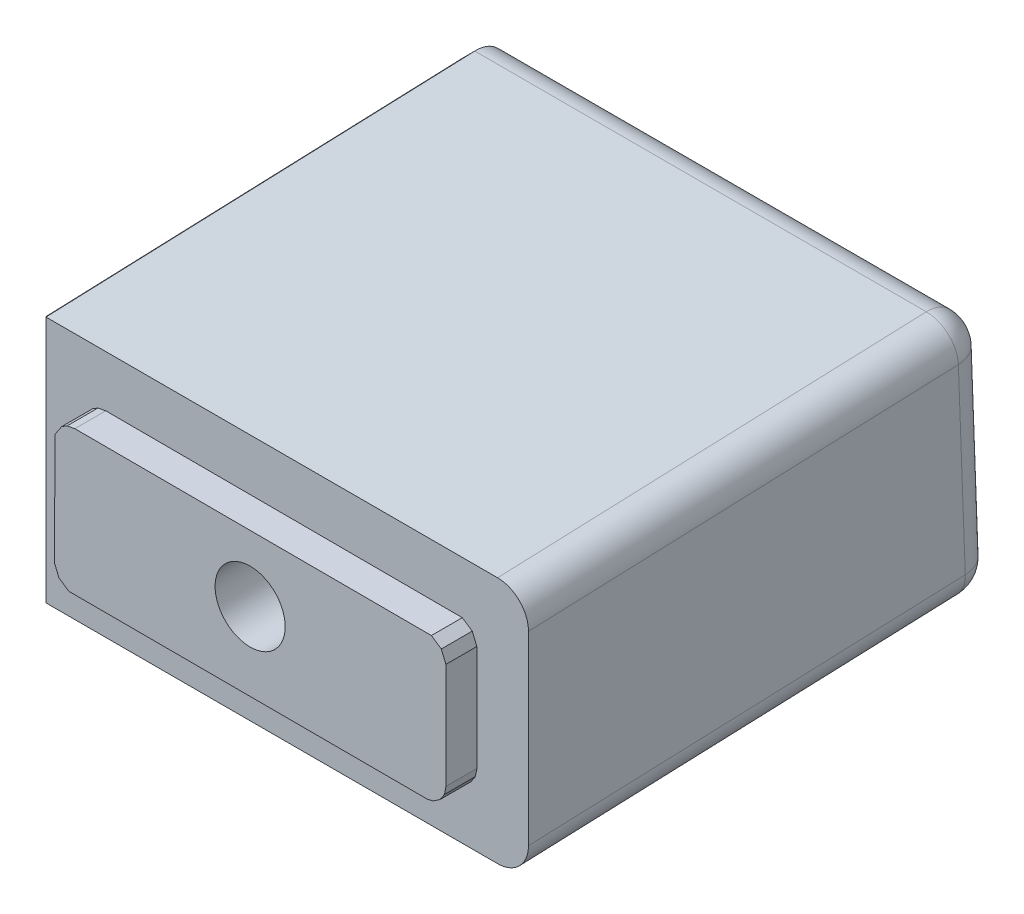
ISO-10303-21;
HEADER;
FILE_DESCRIPTION(('STEP AP214'),'2;1');
FILE_NAME('part.step','',(''),(''),'','','');
FILE_SCHEMA(('AUTOMOTIVE_DESIGN { 1 0 10303 214 1 1 1 1 }'));
ENDSEC;
DATA;
#1=APPLICATION_CONTEXT('core data for automotive mechanical design processes');
#2=APPLICATION_PROTOCOL_DEFINITION('international standard','automotive_design',2000,#1);
#3=PRODUCT_CONTEXT('',#1,'mechanical');
#4=PRODUCT('Part','Part','',(#3));
#5=PRODUCT_RELATED_PRODUCT_CATEGORY('part','',(#4));
#6=PRODUCT_DEFINITION_FORMATION('','',#4);
#7=PRODUCT_DEFINITION_CONTEXT('part definition',#1,'design');
#8=PRODUCT_DEFINITION('design','',#6,#7);
#9=PRODUCT_DEFINITION_SHAPE('','',#8);
#10=(LENGTH_UNIT() NAMED_UNIT(*) SI_UNIT(.MILLI.,.METRE.));
#11=(NAMED_UNIT(*) PLANE_ANGLE_UNIT() SI_UNIT($,.RADIAN.));
#12=(NAMED_UNIT(*) SI_UNIT($,.STERADIAN.) SOLID_ANGLE_UNIT());
#13=UNCERTAINTY_MEASURE_WITH_UNIT(LENGTH_MEASURE(1.E-05),#10,'distance_accuracy_value','');
#14=(GEOMETRIC_REPRESENTATION_CONTEXT(3) GLOBAL_UNCERTAINTY_ASSIGNED_CONTEXT((#13)) GLOBAL_UNIT_ASSIGNED_CONTEXT((#10,
#11,#12)) REPRESENTATION_CONTEXT('',''));
#15=CARTESIAN_POINT('',(0.,0.,0.));
#16=DIRECTION('',(0.,0.,1.));
#17=DIRECTION('',(1.,0.,0.));
#18=AXIS2_PLACEMENT_3D('',#15,#16,#17);
#19=CARTESIAN_POINT('',(2.85,93.6,-63.));
#20=DIRECTION('',(0.,0.,1.));
#21=DIRECTION('',(1.,0.,0.));
#22=AXIS2_PLACEMENT_3D('',#19,#20,#21);
#23=CYLINDRICAL_SURFACE('',#22,1.7);
#24=CARTESIAN_POINT('',(2.85,93.6,-27.6));
#25=DIRECTION('',(0.,0.,1.));
#26=DIRECTION('',(1.,0.,0.));
#27=AXIS2_PLACEMENT_3D('',#24,#25,#26);
#28=CIRCLE('',#27,1.7);
#29=CARTESIAN_POINT('',(4.55,93.6,-27.6));
#30=VERTEX_POINT('',#29);
#31=EDGE_CURVE('E25',#30,#30,#28,.T.);
#32=ORIENTED_EDGE('',*,*,#31,.F.);
#33=DIRECTION('',(0.,0.,1.));
#34=VECTOR('',#33,1.);
#35=CARTESIAN_POINT('',(4.55,93.6,-63.));
#36=LINE('',#35,#34);
#37=CARTESIAN_POINT('',(4.55,93.6,-6.5));
#38=VERTEX_POINT('',#37);
#39=EDGE_CURVE('E9',#30,#38,#36,.T.);
#40=ORIENTED_EDGE('',*,*,#39,.T.);
#41=CARTESIAN_POINT('',(2.85,93.6,-6.5));
#42=DIRECTION('',(0.,0.,1.));
#43=DIRECTION('',(1.,0.,0.));
#44=AXIS2_PLACEMENT_3D('',#41,#42,#43);
#45=CIRCLE('',#44,1.7);
#46=EDGE_CURVE('E382',#38,#38,#45,.T.);
#47=ORIENTED_EDGE('',*,*,#46,.T.);
#48=ORIENTED_EDGE('',*,*,#39,.F.);
#49=EDGE_LOOP('',(#32,#40,#47,#48));
#50=FACE_BOUND('',#49,.T.);
#51=ADVANCED_FACE('F14',(#50),#23,.F.);
#52=CARTESIAN_POINT('',(2.85,93.6,-27.6));
#53=DIRECTION('',(0.,0.,1.));
#54=DIRECTION('',(1.,0.,0.));
#55=AXIS2_PLACEMENT_3D('',#52,#53,#54);
#56=PLANE('',#55);
#57=ORIENTED_EDGE('',*,*,#31,.T.);
#58=EDGE_LOOP('',(#57));
#59=FACE_BOUND('',#58,.T.);
#60=CARTESIAN_POINT('',(2.85,93.6,-27.6));
#61=DIRECTION('',(0.,0.,1.));
#62=DIRECTION('',(1.,0.,0.));
#63=AXIS2_PLACEMENT_3D('',#60,#61,#62);
#64=CIRCLE('',#63,3.6);
#65=CARTESIAN_POINT('',(6.45,93.6,-27.6));
#66=VERTEX_POINT('',#65);
#67=EDGE_CURVE('E422',#66,#66,#64,.T.);
#68=ORIENTED_EDGE('',*,*,#67,.F.);
#69=EDGE_LOOP('',(#68));
#70=FACE_BOUND('',#69,.T.);
#71=ADVANCED_FACE('F693',(#59,#70),#56,.F.);
#72=CARTESIAN_POINT('',(2.853684738631,93.312460914306,-6.5));
#73=DIRECTION('',(0.,0.,1.));
#74=DIRECTION('',(1.,0.,0.));
#75=AXIS2_PLACEMENT_3D('',#72,#73,#74);
#76=PLANE('',#75);
#77=ORIENTED_EDGE('',*,*,#46,.F.);
#78=EDGE_LOOP('',(#77));
#79=FACE_BOUND('',#78,.T.);
#80=DIRECTION('',(-0.000940939869505484,0.999999557315983,0.));
#81=VECTOR('',#80,1.);
#82=CARTESIAN_POINT('',(12.35,90.802411089177,-6.5));
#83=LINE('',#82,#81);
#84=CARTESIAN_POINT('',(12.35,90.802411089177,-6.5));
#85=VERTEX_POINT('',#84);
#86=CARTESIAN_POINT('',(12.345184726672,95.919923219564,-6.5));
#87=VERTEX_POINT('',#86);
#88=EDGE_CURVE('E429',#85,#87,#83,.T.);
#89=ORIENTED_EDGE('',*,*,#88,.T.);
#90=DIRECTION('',(-0.382683432365114,0.923879532511277,0.));
#91=VECTOR('',#90,1.);
#92=CARTESIAN_POINT('',(12.345184726672,95.919923219564,-6.5));
#93=LINE('',#92,#91);
#94=CARTESIAN_POINT('',(12.123010453363,96.456299363398,-6.5));
#95=VERTEX_POINT('',#94);
#96=EDGE_CURVE('E361',#87,#95,#93,.T.);
#97=ORIENTED_EDGE('',*,*,#96,.T.);
#98=DIRECTION('',(-0.831469612302502,0.555570233019667,0.));
#99=VECTOR('',#98,1.);
#100=CARTESIAN_POINT('',(12.123010453363,96.456299363398,-6.5));
#101=LINE('',#100,#99);
#102=CARTESIAN_POINT('',(11.640284677254,96.778846414967,-6.5));
#103=VERTEX_POINT('',#102);
#104=EDGE_CURVE('E346',#95,#103,#101,.T.);
#105=ORIENTED_EDGE('',*,*,#104,.T.);
#106=DIRECTION('',(-0.999996898977086,0.00249038876701822,0.));
#107=VECTOR('',#106,1.);
#108=CARTESIAN_POINT('',(11.640284677254,96.778846414967,-6.5));
#109=LINE('',#108,#107);
#110=CARTESIAN_POINT('',(-5.65,96.821906079235,-6.5));
#111=VERTEX_POINT('',#110);
#112=EDGE_CURVE('E345',#103,#111,#109,.T.);
#113=ORIENTED_EDGE('',*,*,#112,.T.);
#114=DIRECTION('',(-0.980785280403246,-0.195090322016049,0.));
#115=VECTOR('',#114,1.);
#116=CARTESIAN_POINT('',(-5.65,96.821906079235,-6.5));
#117=LINE('',#116,#115);
#118=CARTESIAN_POINT('',(-6.032683432365,96.745785611746,-6.5));
#119=VERTEX_POINT('',#118);
#120=EDGE_CURVE('E491',#111,#119,#117,.T.);
#121=ORIENTED_EDGE('',*,*,#120,.T.);
#122=DIRECTION('',(-0.857728610000298,-0.514102744193179,0.));
#123=VECTOR('',#122,1.);
#124=CARTESIAN_POINT('',(-6.032683432365,96.745785611746,-6.5));
#125=LINE('',#124,#123);
#126=CARTESIAN_POINT('',(-6.284393284164,96.594916532597,-6.5));
#127=VERTEX_POINT('',#126);
#128=EDGE_CURVE('E534',#119,#127,#125,.T.);
#129=ORIENTED_EDGE('',*,*,#128,.T.);
#130=DIRECTION('',(-0.555570233019667,-0.831469612302502,0.));
#131=VECTOR('',#130,1.);
#132=CARTESIAN_POINT('',(-6.284393284164,96.594916532597,-6.5));
#133=LINE('',#132,#131);
#134=CARTESIAN_POINT('',(-6.606940335732,96.112190756489,-6.5));
#135=VERTEX_POINT('',#134);
#136=EDGE_CURVE('E324',#127,#135,#133,.T.);
#137=ORIENTED_EDGE('',*,*,#136,.T.);
#138=DIRECTION('',(-0.00707190672129905,-0.999974993755006,0.));
#139=VECTOR('',#138,1.);
#140=CARTESIAN_POINT('',(-6.606940335732,96.112190756489,-6.5));
#141=LINE('',#140,#139);
#142=CARTESIAN_POINT('',(-6.645184726672,90.704393948848,-6.5));
#143=VERTEX_POINT('',#142);
#144=EDGE_CURVE('E495',#135,#143,#141,.T.);
#145=ORIENTED_EDGE('',*,*,#144,.T.);
#146=DIRECTION('',(0.382683432365114,-0.923879532511277,0.));
#147=VECTOR('',#146,1.);
#148=CARTESIAN_POINT('',(-6.645184726672,90.704393948848,-6.5));
#149=LINE('',#148,#147);
#150=CARTESIAN_POINT('',(-6.423010453363,90.168017805014,-6.5));
#151=VERTEX_POINT('',#150);
#152=EDGE_CURVE('E478',#143,#151,#149,.T.);
#153=ORIENTED_EDGE('',*,*,#152,.T.);
#154=DIRECTION('',(0.831469612302502,-0.555570233019667,0.));
#155=VECTOR('',#154,1.);
#156=CARTESIAN_POINT('',(-6.423010453363,90.168017805014,-6.5));
#157=LINE('',#156,#155);
#158=CARTESIAN_POINT('',(-5.940284677254,89.845470753445,-6.5));
#159=VERTEX_POINT('',#158);
#160=EDGE_CURVE('E477',#151,#159,#157,.T.);
#161=ORIENTED_EDGE('',*,*,#160,.T.);
#162=DIRECTION('',(0.999997581257772,-0.0021994268812365,0.));
#163=VECTOR('',#162,1.);
#164=CARTESIAN_POINT('',(-5.940284677254,89.845470753445,-6.5));
#165=LINE('',#164,#163);
#166=CARTESIAN_POINT('',(11.44801714033,89.807226362505,-6.5));
#167=VERTEX_POINT('',#166);
#168=EDGE_CURVE('E279',#159,#167,#165,.T.);
#169=ORIENTED_EDGE('',*,*,#168,.T.);
#170=DIRECTION('',(0.970031253194633,0.242980179902908,0.));
#171=VECTOR('',#170,1.);
#172=CARTESIAN_POINT('',(11.44801714033,89.807226362505,-6.5));
#173=LINE('',#172,#171);
#174=CARTESIAN_POINT('',(11.732683432365,89.878531556666,-6.5));
#175=VERTEX_POINT('',#174);
#176=EDGE_CURVE('E278',#167,#175,#173,.T.);
#177=ORIENTED_EDGE('',*,*,#176,.T.);
#178=DIRECTION('',(0.831469612302502,0.555570233019667,0.));
#179=VECTOR('',#178,1.);
#180=CARTESIAN_POINT('',(11.732683432365,89.878531556666,-6.5));
#181=LINE('',#180,#179);
#182=CARTESIAN_POINT('',(12.057106781187,90.095304307991,-6.5));
#183=VERTEX_POINT('',#182);
#184=EDGE_CURVE('E274',#175,#183,#181,.T.);
#185=ORIENTED_EDGE('',*,*,#184,.T.);
#186=DIRECTION('',(0.555570233019667,0.831469612302502,0.));
#187=VECTOR('',#186,1.);
#188=CARTESIAN_POINT('',(12.057106781187,90.095304307991,-6.5));
#189=LINE('',#188,#187);
#190=CARTESIAN_POINT('',(12.273879532511,90.419727656812,-6.5));
#191=VERTEX_POINT('',#190);
#192=EDGE_CURVE('E489',#183,#191,#189,.T.);
#193=ORIENTED_EDGE('',*,*,#192,.T.);
#194=DIRECTION('',(0.195090322016049,0.980785280403246,0.));
#195=VECTOR('',#194,1.);
#196=CARTESIAN_POINT('',(12.273879532511,90.419727656812,-6.5));
#197=LINE('',#196,#195);
#198=EDGE_CURVE('E433',#191,#85,#197,.T.);
#199=ORIENTED_EDGE('',*,*,#198,.T.);
#200=EDGE_LOOP('',(#89,#97,#105,#113,#121,#129,#137,#145,#153,#161,#169,#177,#185,#193,#199));
#201=FACE_BOUND('',#200,.T.);
#202=ADVANCED_FACE('F577',(#79,#201),#76,.T.);
#203=CARTESIAN_POINT('',(13.35,89.592540696451,-29.18551373237));
#204=DIRECTION('',(0.,-0.0372208436724684,0.999307064318225));
#205=DIRECTION('',(0.,-0.999307064318225,-0.0372208436724684));
#206=AXIS2_PLACEMENT_3D('',#203,#204,#205);
#207=SPHERICAL_SURFACE('',#206,1.5);
#208=CARTESIAN_POINT('',(13.35,89.592540696451,-29.18551373237));
#209=DIRECTION('',(-1.,0.,0.));
#210=DIRECTION('',(0.,-0.999307064318225,-0.0372208436724684));
#211=AXIS2_PLACEMENT_3D('',#208,#209,#210);
#212=CIRCLE('',#211,1.5);
#213=CARTESIAN_POINT('',(13.35,89.64837196196,-30.68447432885));
#214=VERTEX_POINT('',#213);
#215=CARTESIAN_POINT('',(13.35,88.093580099974,-29.24134499788));
#216=VERTEX_POINT('',#215);
#217=EDGE_CURVE('E379',#214,#216,#212,.T.);
#218=ORIENTED_EDGE('',*,*,#217,.F.);
#219=CARTESIAN_POINT('',(13.35,89.592540696451,-29.18551373237));
#220=DIRECTION('',(0.,-0.999307064318225,-0.0372208436724684));
#221=DIRECTION('',(1.,0.,0.));
#222=AXIS2_PLACEMENT_3D('',#219,#220,#221);
#223=CIRCLE('',#222,1.5);
#224=CARTESIAN_POINT('',(14.85,89.592540696451,-29.18551373237));
#225=VERTEX_POINT('',#224);
#226=EDGE_CURVE('E466',#214,#225,#223,.T.);
#227=ORIENTED_EDGE('',*,*,#226,.T.);
#228=CARTESIAN_POINT('',(13.35,89.592540696451,-29.18551373237));
#229=DIRECTION('',(0.,-0.0372208436724684,0.999307064318225));
#230=DIRECTION('',(0.,-0.999307064318225,-0.0372208436724684));
#231=AXIS2_PLACEMENT_3D('',#228,#229,#230);
#232=CIRCLE('',#231,1.5);
#233=EDGE_CURVE('E391',#216,#225,#232,.T.);
#234=ORIENTED_EDGE('',*,*,#233,.F.);
#235=EDGE_LOOP('',(#218,#227,#234));
#236=FACE_BOUND('',#235,.T.);
#237=ADVANCED_FACE('F682',(#236),#207,.T.);
#238=CARTESIAN_POINT('',(2.85,93.6,-33.6));
#239=DIRECTION('',(0.,0.,1.));
#240=DIRECTION('',(1.,0.,0.));
#241=AXIS2_PLACEMENT_3D('',#238,#239,#240);
#242=CYLINDRICAL_SURFACE('',#241,3.6);
#243=CARTESIAN_POINT('',(2.85,93.6,-30.53728940971));
#244=DIRECTION('',(0.,-0.0372208436724684,0.999307064318225));
#245=DIRECTION('',(0.,0.999307064318225,0.0372208436724684));
#246=AXIS2_PLACEMENT_3D('',#243,#244,#245);
#247=ELLIPSE('',#246,3.602496298229,3.6);
#248=CARTESIAN_POINT('',(6.45,93.6,-30.53728940971));
#249=VERTEX_POINT('',#248);
#250=EDGE_CURVE('E368',#249,#249,#247,.T.);
#251=ORIENTED_EDGE('',*,*,#250,.F.);
#252=DIRECTION('',(0.,0.,1.));
#253=VECTOR('',#252,1.);
#254=CARTESIAN_POINT('',(6.45,93.6,-33.6));
#255=LINE('',#254,#253);
#256=EDGE_CURVE('E469',#249,#66,#255,.T.);
#257=ORIENTED_EDGE('',*,*,#256,.T.);
#258=ORIENTED_EDGE('',*,*,#67,.T.);
#259=ORIENTED_EDGE('',*,*,#256,.F.);
#260=EDGE_LOOP('',(#251,#257,#258,#259));
#261=FACE_BOUND('',#260,.T.);
#262=ADVANCED_FACE('F684',(#261),#242,.F.);
#263=CARTESIAN_POINT('',(13.35,88.093580099974,-29.24134499788));
#264=DIRECTION('',(0.,0.999307064318225,0.0372208436724684));
#265=DIRECTION('',(0.,0.0372208436724684,-0.999307064318225));
#266=AXIS2_PLACEMENT_3D('',#263,#264,#265);
#267=CYLINDRICAL_SURFACE('',#266,1.5);
#268=DIRECTION('',(0.,0.999307064318225,0.0372208436724684));
#269=VECTOR('',#268,1.);
#270=CARTESIAN_POINT('',(13.35,88.149411365483,-30.74030559436));
#271=LINE('',#270,#269);
#272=CARTESIAN_POINT('',(13.35,98.642135540824,-30.3494867358));
#273=VERTEX_POINT('',#272);
#274=EDGE_CURVE('E369',#214,#273,#271,.T.);
#275=ORIENTED_EDGE('',*,*,#274,.T.);
#276=CARTESIAN_POINT('',(13.35,98.586304275316,-28.85052613932));
#277=DIRECTION('',(0.,-0.999307064318225,-0.0372208436724684));
#278=DIRECTION('',(1.,0.,0.));
#279=AXIS2_PLACEMENT_3D('',#276,#277,#278);
#280=CIRCLE('',#279,1.5);
#281=CARTESIAN_POINT('',(14.85,98.586304275315,-28.85052613932));
#282=VERTEX_POINT('',#281);
#283=EDGE_CURVE('E432',#273,#282,#280,.T.);
#284=ORIENTED_EDGE('',*,*,#283,.T.);
#285=DIRECTION('',(0.,0.999307064318225,0.0372208436724684));
#286=VECTOR('',#285,1.);
#287=CARTESIAN_POINT('',(14.85,88.093580099974,-29.24134499788));
#288=LINE('',#287,#286);
#289=EDGE_CURVE('E395',#225,#282,#288,.T.);
#290=ORIENTED_EDGE('',*,*,#289,.F.);
#291=ORIENTED_EDGE('',*,*,#226,.F.);
#292=EDGE_LOOP('',(#275,#284,#290,#291));
#293=FACE_BOUND('',#292,.T.);
#294=ADVANCED_FACE('F680',(#293),#267,.T.);
#295=CARTESIAN_POINT('',(13.35,98.586304275316,-28.85052613932));
#296=DIRECTION('',(0.,-0.0372208436724684,0.999307064318225));
#297=DIRECTION('',(0.,0.999307064318225,0.0372208436724684));
#298=AXIS2_PLACEMENT_3D('',#295,#296,#297);
#299=SPHERICAL_SURFACE('',#298,1.5);
#300=CARTESIAN_POINT('',(13.35,98.586304275316,-28.85052613932));
#301=DIRECTION('',(0.,0.0372208436724684,-0.999307064318225));
#302=DIRECTION('',(0.,0.999307064318225,0.0372208436724684));
#303=AXIS2_PLACEMENT_3D('',#300,#301,#302);
#304=CIRCLE('',#303,1.5);
#305=CARTESIAN_POINT('',(13.35,100.08526487179,-28.79469487381));
#306=VERTEX_POINT('',#305);
#307=EDGE_CURVE('E336',#306,#282,#304,.T.);
#308=ORIENTED_EDGE('',*,*,#307,.T.);
#309=ORIENTED_EDGE('',*,*,#283,.F.);
#310=CARTESIAN_POINT('',(13.35,98.586304275316,-28.85052613932));
#311=DIRECTION('',(1.,0.,0.));
#312=DIRECTION('',(0.,0.999307064318225,0.0372208436724684));
#313=AXIS2_PLACEMENT_3D('',#310,#311,#312);
#314=CIRCLE('',#313,1.5);
#315=EDGE_CURVE('E347',#273,#306,#314,.T.);
#316=ORIENTED_EDGE('',*,*,#315,.T.);
#317=EDGE_LOOP('',(#308,#309,#316));
#318=FACE_BOUND('',#317,.T.);
#319=ADVANCED_FACE('F677',(#318),#299,.T.);
#320=CARTESIAN_POINT('',(12.35,90.802411089177,-8.01));
#321=DIRECTION('',(-0.999999557315983,-0.000940939869505484,0.));
#322=DIRECTION('',(-0.000940939869505484,0.999999557315983,0.));
#323=AXIS2_PLACEMENT_3D('',#320,#321,#322);
#324=PLANE('',#323);
#325=DIRECTION('',(0.,0.,1.));
#326=VECTOR('',#325,1.);
#327=CARTESIAN_POINT('',(12.345184726672,95.919923219564,-8.01));
#328=LINE('',#327,#326);
#329=CARTESIAN_POINT('',(12.345184726672,95.919923219564,-8.));
#330=VERTEX_POINT('',#329);
#331=EDGE_CURVE('E356',#330,#87,#328,.T.);
#332=ORIENTED_EDGE('',*,*,#331,.T.);
#333=ORIENTED_EDGE('',*,*,#88,.F.);
#334=DIRECTION('',(0.,0.,1.));
#335=VECTOR('',#334,1.);
#336=CARTESIAN_POINT('',(12.35,90.802411089177,-8.01));
#337=LINE('',#336,#335);
#338=CARTESIAN_POINT('',(12.35,90.802411089177,-8.));
#339=VERTEX_POINT('',#338);
#340=EDGE_CURVE('E511',#339,#85,#337,.T.);
#341=ORIENTED_EDGE('',*,*,#340,.F.);
#342=DIRECTION('',(0.000940939869505484,-0.999999557315983,0.));
#343=VECTOR('',#342,1.);
#344=CARTESIAN_POINT('',(12.369184568061,70.413691054912,-8.));
#345=LINE('',#344,#343);
#346=EDGE_CURVE('E322',#330,#339,#345,.T.);
#347=ORIENTED_EDGE('',*,*,#346,.F.);
#348=EDGE_LOOP('',(#332,#333,#341,#347));
#349=FACE_BOUND('',#348,.T.);
#350=ADVANCED_FACE('F585',(#349),#324,.F.);
#351=CARTESIAN_POINT('',(12.273879532511,90.419727656812,-8.01));
#352=DIRECTION('',(-0.980785280403246,0.195090322016049,0.));
#353=DIRECTION('',(0.,0.,1.));
#354=AXIS2_PLACEMENT_3D('',#351,#352,#353);
#355=PLANE('',#354);
#356=ORIENTED_EDGE('',*,*,#340,.T.);
#357=ORIENTED_EDGE('',*,*,#198,.F.);
#358=DIRECTION('',(0.,0.,1.));
#359=VECTOR('',#358,1.);
#360=CARTESIAN_POINT('',(12.273879532511,90.419727656812,-8.01));
#361=LINE('',#360,#359);
#362=CARTESIAN_POINT('',(12.273879532511,90.419727656812,-8.));
#363=VERTEX_POINT('',#362);
#364=EDGE_CURVE('E417',#363,#191,#361,.T.);
#365=ORIENTED_EDGE('',*,*,#364,.F.);
#366=DIRECTION('',(-0.195090322016049,-0.980785280403246,0.));
#367=VECTOR('',#366,1.);
#368=CARTESIAN_POINT('',(7.904039988048,68.451060740681,-8.));
#369=LINE('',#368,#367);
#370=EDGE_CURVE('E304',#339,#363,#369,.T.);
#371=ORIENTED_EDGE('',*,*,#370,.F.);
#372=EDGE_LOOP('',(#356,#357,#365,#371));
#373=FACE_BOUND('',#372,.T.);
#374=ADVANCED_FACE('F582',(#373),#355,.F.);
#375=CARTESIAN_POINT('',(12.057106781187,90.095304307991,-8.01));
#376=DIRECTION('',(-0.831469612302502,0.555570233019667,0.));
#377=DIRECTION('',(0.,0.,1.));
#378=AXIS2_PLACEMENT_3D('',#375,#376,#377);
#379=PLANE('',#378);
#380=ORIENTED_EDGE('',*,*,#364,.T.);
#381=ORIENTED_EDGE('',*,*,#192,.F.);
#382=DIRECTION('',(0.,0.,1.));
#383=VECTOR('',#382,1.);
#384=CARTESIAN_POINT('',(12.057106781187,90.095304307991,-8.01));
#385=LINE('',#384,#383);
#386=CARTESIAN_POINT('',(12.057106781187,90.095304307991,-8.));
#387=VERTEX_POINT('',#386);
#388=EDGE_CURVE('E308',#387,#183,#385,.T.);
#389=ORIENTED_EDGE('',*,*,#388,.F.);
#390=DIRECTION('',(-0.555570233019667,-0.831469612302502,0.));
#391=VECTOR('',#390,1.);
#392=CARTESIAN_POINT('',(-1.248221270255,70.182473672048,-8.));
#393=LINE('',#392,#391);
#394=EDGE_CURVE('E297',#363,#387,#393,.T.);
#395=ORIENTED_EDGE('',*,*,#394,.F.);
#396=EDGE_LOOP('',(#380,#381,#389,#395));
#397=FACE_BOUND('',#396,.T.);
#398=ADVANCED_FACE('F579',(#397),#379,.F.);
#399=CARTESIAN_POINT('',(11.732683432365,89.878531556666,-8.01));
#400=DIRECTION('',(-0.555570233019667,0.831469612302502,0.));
#401=DIRECTION('',(0.,0.,1.));
#402=AXIS2_PLACEMENT_3D('',#399,#400,#401);
#403=PLANE('',#402);
#404=ORIENTED_EDGE('',*,*,#388,.T.);
#405=ORIENTED_EDGE('',*,*,#184,.F.);
#406=DIRECTION('',(0.,0.,1.));
#407=VECTOR('',#406,1.);
#408=CARTESIAN_POINT('',(11.732683432365,89.878531556666,-8.01));
#409=LINE('',#408,#407);
#410=CARTESIAN_POINT('',(11.732683432365,89.878531556666,-8.));
#411=VERTEX_POINT('',#410);
#412=EDGE_CURVE('E266',#411,#175,#409,.T.);
#413=ORIENTED_EDGE('',*,*,#412,.F.);
#414=DIRECTION('',(-0.831469612302502,-0.555570233019667,0.));
#415=VECTOR('',#414,1.);
#416=CARTESIAN_POINT('',(-6.424945732358,77.745991633538,-8.));
#417=LINE('',#416,#415);
#418=EDGE_CURVE('E271',#387,#411,#417,.T.);
#419=ORIENTED_EDGE('',*,*,#418,.F.);
#420=EDGE_LOOP('',(#404,#405,#413,#419));
#421=FACE_BOUND('',#420,.T.);
#422=ADVANCED_FACE('F269',(#421),#403,.F.);
#423=CARTESIAN_POINT('',(11.44801714033,89.807226362505,-8.01));
#424=DIRECTION('',(-0.242980179902908,0.970031253194633,0.));
#425=DIRECTION('',(0.,0.,1.));
#426=AXIS2_PLACEMENT_3D('',#423,#424,#425);
#427=PLANE('',#426);
#428=ORIENTED_EDGE('',*,*,#412,.T.);
#429=ORIENTED_EDGE('',*,*,#176,.F.);
#430=DIRECTION('',(0.,0.,1.));
#431=VECTOR('',#430,1.);
#432=CARTESIAN_POINT('',(11.44801714033,89.807226362505,-8.01));
#433=LINE('',#432,#431);
#434=CARTESIAN_POINT('',(11.44801714033,89.807226362505,-8.));
#435=VERTEX_POINT('',#434);
#436=EDGE_CURVE('E285',#435,#167,#433,.T.);
#437=ORIENTED_EDGE('',*,*,#436,.F.);
#438=DIRECTION('',(-0.970031253194633,-0.242980179902908,0.));
#439=VECTOR('',#438,1.);
#440=CARTESIAN_POINT('',(-5.2865952074,85.615424185543,-8.));
#441=LINE('',#440,#439);
#442=EDGE_CURVE('E282',#411,#435,#441,.T.);
#443=ORIENTED_EDGE('',*,*,#442,.F.);
#444=EDGE_LOOP('',(#428,#429,#437,#443));
#445=FACE_BOUND('',#444,.T.);
#446=ADVANCED_FACE('F283',(#445),#427,.F.);
#447=CARTESIAN_POINT('',(-5.940284677254,89.845470753445,-8.01));
#448=DIRECTION('',(0.0021994268812365,0.999997581257772,0.));
#449=DIRECTION('',(0.,0.,-1.));
#450=AXIS2_PLACEMENT_3D('',#447,#448,#449);
#451=PLANE('',#450);
#452=ORIENTED_EDGE('',*,*,#436,.T.);
#453=ORIENTED_EDGE('',*,*,#168,.F.);
#454=DIRECTION('',(0.,0.,1.));
#455=VECTOR('',#454,1.);
#456=CARTESIAN_POINT('',(-5.940284677254,89.845470753445,-8.01));
#457=LINE('',#456,#455);
#458=CARTESIAN_POINT('',(-5.940284677254,89.845470753445,-8.));
#459=VERTEX_POINT('',#458);
#460=EDGE_CURVE('E473',#459,#159,#457,.T.);
#461=ORIENTED_EDGE('',*,*,#460,.F.);
#462=DIRECTION('',(-0.999997581257772,0.0021994268812365,0.));
#463=VECTOR('',#462,1.);
#464=CARTESIAN_POINT('',(-10.00130398771,89.854402690086,-8.));
#465=LINE('',#464,#463);
#466=EDGE_CURVE('E290',#435,#459,#465,.T.);
#467=ORIENTED_EDGE('',*,*,#466,.F.);
#468=EDGE_LOOP('',(#452,#453,#461,#467));
#469=FACE_BOUND('',#468,.T.);
#470=ADVANCED_FACE('F709',(#469),#451,.F.);
#471=CARTESIAN_POINT('',(-6.423010453363,90.168017805014,-8.01));
#472=DIRECTION('',(0.555570233019667,0.831469612302502,0.));
#473=DIRECTION('',(0.,0.,-1.));
#474=AXIS2_PLACEMENT_3D('',#471,#472,#473);
#475=PLANE('',#474);
#476=ORIENTED_EDGE('',*,*,#460,.T.);
#477=ORIENTED_EDGE('',*,*,#160,.F.);
#478=DIRECTION('',(0.,0.,1.));
#479=VECTOR('',#478,1.);
#480=CARTESIAN_POINT('',(-6.423010453363,90.168017805014,-8.01));
#481=LINE('',#480,#479);
#482=CARTESIAN_POINT('',(-6.423010453363,90.168017805014,-8.));
#483=VERTEX_POINT('',#482);
#484=EDGE_CURVE('E499',#483,#151,#481,.T.);
#485=ORIENTED_EDGE('',*,*,#484,.F.);
#486=DIRECTION('',(-0.831469612302502,0.555570233019667,0.));
#487=VECTOR('',#486,1.);
#488=CARTESIAN_POINT('',(0.183596817489,85.753623957508,-8.));
#489=LINE('',#488,#487);
#490=EDGE_CURVE('E530',#459,#483,#489,.T.);
#491=ORIENTED_EDGE('',*,*,#490,.F.);
#492=EDGE_LOOP('',(#476,#477,#485,#491));
#493=FACE_BOUND('',#492,.T.);
#494=ADVANCED_FACE('F749',(#493),#475,.F.);
#495=CARTESIAN_POINT('',(-6.645184726672,90.704393948848,-8.01));
#496=DIRECTION('',(0.923879532511277,0.382683432365114,0.));
#497=DIRECTION('',(0.,0.,-1.));
#498=AXIS2_PLACEMENT_3D('',#495,#496,#497);
#499=PLANE('',#498);
#500=ORIENTED_EDGE('',*,*,#484,.T.);
#501=ORIENTED_EDGE('',*,*,#152,.F.);
#502=DIRECTION('',(0.,0.,1.));
#503=VECTOR('',#502,1.);
#504=CARTESIAN_POINT('',(-6.645184726672,90.704393948848,-8.01));
#505=LINE('',#504,#503);
#506=CARTESIAN_POINT('',(-6.645184726672,90.704393948848,-8.));
#507=VERTEX_POINT('',#506);
#508=EDGE_CURVE('E328',#507,#143,#505,.T.);
#509=ORIENTED_EDGE('',*,*,#508,.F.);
#510=DIRECTION('',(-0.382683432365114,0.923879532511277,0.));
#511=VECTOR('',#510,1.);
#512=CARTESIAN_POINT('',(0.0008761441561558,74.659383658137,-8.));
#513=LINE('',#512,#511);
#514=EDGE_CURVE('E572',#483,#507,#513,.T.);
#515=ORIENTED_EDGE('',*,*,#514,.F.);
#516=EDGE_LOOP('',(#500,#501,#509,#515));
#517=FACE_BOUND('',#516,.T.);
#518=ADVANCED_FACE('F746',(#517),#499,.F.);
#519=CARTESIAN_POINT('',(-6.606940335732,96.112190756489,-8.01));
#520=DIRECTION('',(0.999974993755006,-0.00707190672129905,0.));
#521=DIRECTION('',(0.,0.,-1.));
#522=AXIS2_PLACEMENT_3D('',#519,#520,#521);
#523=PLANE('',#522);
#524=ORIENTED_EDGE('',*,*,#508,.T.);
#525=ORIENTED_EDGE('',*,*,#144,.F.);
#526=DIRECTION('',(0.,0.,1.));
#527=VECTOR('',#526,1.);
#528=CARTESIAN_POINT('',(-6.606940335732,96.112190756489,-8.01));
#529=LINE('',#528,#527);
#530=CARTESIAN_POINT('',(-6.606940335732,96.112190756489,-8.));
#531=VERTEX_POINT('',#530);
#532=EDGE_CURVE('E329',#531,#135,#529,.T.);
#533=ORIENTED_EDGE('',*,*,#532,.F.);
#534=DIRECTION('',(0.00707190672129905,0.999974993755006,0.));
#535=VECTOR('',#534,1.);
#536=CARTESIAN_POINT('',(-6.770175435562,73.030577216361,-8.));
#537=LINE('',#536,#535);
#538=EDGE_CURVE('E569',#507,#531,#537,.T.);
#539=ORIENTED_EDGE('',*,*,#538,.F.);
#540=EDGE_LOOP('',(#524,#525,#533,#539));
#541=FACE_BOUND('',#540,.T.);
#542=ADVANCED_FACE('F743',(#541),#523,.F.);
#543=CARTESIAN_POINT('',(-6.284393284164,96.594916532597,-8.01));
#544=DIRECTION('',(0.831469612302502,-0.555570233019667,0.));
#545=DIRECTION('',(0.,0.,-1.));
#546=AXIS2_PLACEMENT_3D('',#543,#544,#545);
#547=PLANE('',#546);
#548=ORIENTED_EDGE('',*,*,#532,.T.);
#549=ORIENTED_EDGE('',*,*,#136,.F.);
#550=DIRECTION('',(0.,0.,1.));
#551=VECTOR('',#550,1.);
#552=CARTESIAN_POINT('',(-6.284393284164,96.594916532597,-8.01));
#553=LINE('',#552,#551);
#554=CARTESIAN_POINT('',(-6.284393284164,96.594916532597,-8.));
#555=VERTEX_POINT('',#554);
#556=EDGE_CURVE('E414',#555,#127,#553,.T.);
#557=ORIENTED_EDGE('',*,*,#556,.F.);
#558=DIRECTION('',(0.555570233019667,0.831469612302502,0.));
#559=VECTOR('',#558,1.);
#560=CARTESIAN_POINT('',(-18.26030804509,78.671693488197,-8.));
#561=LINE('',#560,#559);
#562=EDGE_CURVE('E527',#531,#555,#561,.T.);
#563=ORIENTED_EDGE('',*,*,#562,.F.);
#564=EDGE_LOOP('',(#548,#549,#557,#563));
#565=FACE_BOUND('',#564,.T.);
#566=ADVANCED_FACE('F739',(#565),#547,.F.);
#567=CARTESIAN_POINT('',(-6.032683432365,96.745785611746,-8.01));
#568=DIRECTION('',(0.514102744193179,-0.857728610000298,0.));
#569=DIRECTION('',(0.,0.,-1.));
#570=AXIS2_PLACEMENT_3D('',#567,#568,#569);
#571=PLANE('',#570);
#572=ORIENTED_EDGE('',*,*,#556,.T.);
#573=ORIENTED_EDGE('',*,*,#128,.F.);
#574=DIRECTION('',(0.,0.,1.));
#575=VECTOR('',#574,1.);
#576=CARTESIAN_POINT('',(-6.032683432365,96.745785611746,-8.01));
#577=LINE('',#576,#575);
#578=CARTESIAN_POINT('',(-6.032683432365,96.745785611746,-8.));
#579=VERTEX_POINT('',#578);
#580=EDGE_CURVE('E486',#579,#119,#577,.T.);
#581=ORIENTED_EDGE('',*,*,#580,.F.);
#582=DIRECTION('',(0.857728610000298,0.514102744193179,0.));
#583=VECTOR('',#582,1.);
#584=CARTESIAN_POINT('',(-19.32515729713,88.778583385634,-8.));
#585=LINE('',#584,#583);
#586=EDGE_CURVE('E335',#555,#579,#585,.T.);
#587=ORIENTED_EDGE('',*,*,#586,.F.);
#588=EDGE_LOOP('',(#572,#573,#581,#587));
#589=FACE_BOUND('',#588,.T.);
#590=ADVANCED_FACE('F724',(#589),#571,.F.);
#591=CARTESIAN_POINT('',(-5.65,96.821906079235,-8.01));
#592=DIRECTION('',(0.195090322016049,-0.980785280403246,0.));
#593=DIRECTION('',(0.,0.,-1.));
#594=AXIS2_PLACEMENT_3D('',#591,#592,#593);
#595=PLANE('',#594);
#596=ORIENTED_EDGE('',*,*,#580,.T.);
#597=ORIENTED_EDGE('',*,*,#120,.F.);
#598=DIRECTION('',(0.,0.,1.));
#599=VECTOR('',#598,1.);
#600=CARTESIAN_POINT('',(-5.65,96.821906079235,-8.01));
#601=LINE('',#600,#599);
#602=CARTESIAN_POINT('',(-5.65,96.821906079235,-8.));
#603=VERTEX_POINT('',#602);
#604=EDGE_CURVE('E341',#603,#111,#601,.T.);
#605=ORIENTED_EDGE('',*,*,#604,.F.);
#606=DIRECTION('',(0.980785280403246,0.195090322016049,0.));
#607=VECTOR('',#606,1.);
#608=CARTESIAN_POINT('',(-14.21773593865,95.117677440593,-8.));
#609=LINE('',#608,#607);
#610=EDGE_CURVE('E330',#579,#603,#609,.T.);
#611=ORIENTED_EDGE('',*,*,#610,.F.);
#612=EDGE_LOOP('',(#596,#597,#605,#611));
#613=FACE_BOUND('',#612,.T.);
#614=ADVANCED_FACE('F718',(#613),#595,.F.);
#615=CARTESIAN_POINT('',(11.640284677254,96.778846414967,-8.01));
#616=DIRECTION('',(-0.00249038876701822,-0.999996898977086,0.));
#617=DIRECTION('',(-0.999996898977086,0.00249038876701822,0.));
#618=AXIS2_PLACEMENT_3D('',#615,#616,#617);
#619=PLANE('',#618);
#620=ORIENTED_EDGE('',*,*,#604,.T.);
#621=ORIENTED_EDGE('',*,*,#112,.F.);
#622=DIRECTION('',(0.,0.,1.));
#623=VECTOR('',#622,1.);
#624=CARTESIAN_POINT('',(11.640284677254,96.778846414967,-8.01));
#625=LINE('',#624,#623);
#626=CARTESIAN_POINT('',(11.640284677254,96.778846414967,-8.));
#627=VERTEX_POINT('',#626);
#628=EDGE_CURVE('E360',#627,#103,#625,.T.);
#629=ORIENTED_EDGE('',*,*,#628,.F.);
#630=DIRECTION('',(0.999996898977086,-0.00249038876701822,0.));
#631=VECTOR('',#630,1.);
#632=CARTESIAN_POINT('',(-1.196529109041,96.81081517096,-8.));
#633=LINE('',#632,#631);
#634=EDGE_CURVE('E334',#603,#627,#633,.T.);
#635=ORIENTED_EDGE('',*,*,#634,.F.);
#636=EDGE_LOOP('',(#620,#621,#629,#635));
#637=FACE_BOUND('',#636,.T.);
#638=ADVANCED_FACE('F716',(#637),#619,.F.);
#639=CARTESIAN_POINT('',(12.123010453363,96.456299363398,-8.01));
#640=DIRECTION('',(-0.555570233019667,-0.831469612302502,0.));
#641=DIRECTION('',(-0.831469612302502,0.555570233019667,0.));
#642=AXIS2_PLACEMENT_3D('',#639,#640,#641);
#643=PLANE('',#642);
#644=ORIENTED_EDGE('',*,*,#628,.T.);
#645=ORIENTED_EDGE('',*,*,#104,.F.);
#646=DIRECTION('',(0.,0.,1.));
#647=VECTOR('',#646,1.);
#648=CARTESIAN_POINT('',(12.123010453363,96.456299363398,-8.01));
#649=LINE('',#648,#647);
#650=CARTESIAN_POINT('',(12.123010453363,96.456299363398,-8.));
#651=VERTEX_POINT('',#650);
#652=EDGE_CURVE('E394',#651,#95,#649,.T.);
#653=ORIENTED_EDGE('',*,*,#652,.F.);
#654=DIRECTION('',(0.831469612302502,-0.555570233019667,0.));
#655=VECTOR('',#654,1.);
#656=CARTESIAN_POINT('',(13.771202419823,95.355012700219,-8.));
#657=LINE('',#656,#655);
#658=EDGE_CURVE('E352',#627,#651,#657,.T.);
#659=ORIENTED_EDGE('',*,*,#658,.F.);
#660=EDGE_LOOP('',(#644,#645,#653,#659));
#661=FACE_BOUND('',#660,.T.);
#662=ADVANCED_FACE('F596',(#661),#643,.F.);
#663=CARTESIAN_POINT('',(12.345184726672,95.919923219564,-8.01));
#664=DIRECTION('',(-0.923879532511277,-0.382683432365114,0.));
#665=DIRECTION('',(-0.382683432365114,0.923879532511277,0.));
#666=AXIS2_PLACEMENT_3D('',#663,#664,#665);
#667=PLANE('',#666);
#668=ORIENTED_EDGE('',*,*,#652,.T.);
#669=ORIENTED_EDGE('',*,*,#96,.F.);
#670=ORIENTED_EDGE('',*,*,#331,.F.);
#671=DIRECTION('',(0.382683432365114,-0.923879532511277,0.));
#672=VECTOR('',#671,1.);
#673=CARTESIAN_POINT('',(18.522692017289,81.006101336898,-8.));
#674=LINE('',#673,#672);
#675=EDGE_CURVE('E319',#651,#330,#674,.T.);
#676=ORIENTED_EDGE('',*,*,#675,.F.);
#677=EDGE_LOOP('',(#668,#669,#670,#676));
#678=FACE_BOUND('',#677,.T.);
#679=ADVANCED_FACE('F592',(#678),#667,.F.);
#680=CARTESIAN_POINT('',(13.35,89.64837196196,-30.68447432885));
#681=DIRECTION('',(0.,-0.0372208436724684,0.999307064318225));
#682=DIRECTION('',(0.,-0.999307064318225,-0.0372208436724684));
#683=AXIS2_PLACEMENT_3D('',#680,#681,#682);
#684=CYLINDRICAL_SURFACE('',#683,1.5);
#685=DIRECTION('',(0.,-0.0372208436724684,0.999307064318225));
#686=VECTOR('',#685,1.);
#687=CARTESIAN_POINT('',(13.35,88.149411365483,-30.74030559436));
#688=LINE('',#687,#686);
#689=CARTESIAN_POINT('',(13.35,87.302411089177,-8.));
#690=VERTEX_POINT('',#689);
#691=EDGE_CURVE('E428',#216,#690,#688,.T.);
#692=ORIENTED_EDGE('',*,*,#691,.F.);
#693=ORIENTED_EDGE('',*,*,#233,.T.);
#694=DIRECTION('',(0.,-0.0372208436724684,0.999307064318225));
#695=VECTOR('',#694,1.);
#696=CARTESIAN_POINT('',(14.85,89.64837196196,-30.68447432885));
#697=LINE('',#696,#695);
#698=CARTESIAN_POINT('',(14.85,88.803451213439,-8.));
#699=VERTEX_POINT('',#698);
#700=EDGE_CURVE('E18',#225,#699,#697,.T.);
#701=ORIENTED_EDGE('',*,*,#700,.T.);
#702=CARTESIAN_POINT('',(13.35,88.803451213439,-8.));
#703=DIRECTION('',(0.,0.,1.));
#704=DIRECTION('',(0.,-1.,0.));
#705=AXIS2_PLACEMENT_3D('',#702,#703,#704);
#706=ELLIPSE('',#705,1.501040124262,1.5);
#707=EDGE_CURVE('E523',#690,#699,#706,.T.);
#708=ORIENTED_EDGE('',*,*,#707,.F.);
#709=EDGE_LOOP('',(#692,#693,#701,#708));
#710=FACE_BOUND('',#709,.T.);
#711=ADVANCED_FACE('F712',(#710),#684,.T.);
#712=CARTESIAN_POINT('',(14.85,88.149411365483,-30.74030559436));
#713=DIRECTION('',(1.,0.,0.));
#714=DIRECTION('',(0.,1.,0.));
#715=AXIS2_PLACEMENT_3D('',#712,#713,#714);
#716=PLANE('',#715);
#717=DIRECTION('',(0.,-1.,0.));
#718=VECTOR('',#717,1.);
#719=CARTESIAN_POINT('',(14.85,69.074705682741,-8.));
#720=LINE('',#719,#718);
#721=CARTESIAN_POINT('',(14.85,97.80969195901,-8.));
#722=VERTEX_POINT('',#721);
#723=EDGE_CURVE('E519',#722,#699,#720,.T.);
#724=ORIENTED_EDGE('',*,*,#723,.T.);
#725=ORIENTED_EDGE('',*,*,#700,.F.);
#726=ORIENTED_EDGE('',*,*,#289,.T.);
#727=DIRECTION('',(0.,-0.0372208436724684,0.999307064318225));
#728=VECTOR('',#727,1.);
#729=CARTESIAN_POINT('',(14.85,98.642135540824,-30.3494867358));
#730=LINE('',#729,#728);
#731=EDGE_CURVE('E340',#282,#722,#730,.T.);
#732=ORIENTED_EDGE('',*,*,#731,.T.);
#733=EDGE_LOOP('',(#724,#725,#726,#732));
#734=FACE_BOUND('',#733,.T.);
#735=ADVANCED_FACE('F715',(#734),#716,.T.);
#736=CARTESIAN_POINT('',(13.35,98.642135540824,-30.3494867358));
#737=DIRECTION('',(0.,-0.0372208436724684,0.999307064318225));
#738=DIRECTION('',(0.,0.999307064318225,0.0372208436724684));
#739=AXIS2_PLACEMENT_3D('',#736,#737,#738);
#740=CYLINDRICAL_SURFACE('',#739,1.5);
#741=CARTESIAN_POINT('',(13.35,97.80969195901,-8.));
#742=DIRECTION('',(0.,0.,-1.));
#743=DIRECTION('',(0.,-1.,0.));
#744=AXIS2_PLACEMENT_3D('',#741,#742,#743);
#745=ELLIPSE('',#744,1.501040124262,1.5);
#746=CARTESIAN_POINT('',(13.35,99.310732083272,-8.));
#747=VERTEX_POINT('',#746);
#748=EDGE_CURVE('E323',#747,#722,#745,.T.);
#749=ORIENTED_EDGE('',*,*,#748,.T.);
#750=ORIENTED_EDGE('',*,*,#731,.F.);
#751=ORIENTED_EDGE('',*,*,#307,.F.);
#752=DIRECTION('',(0.,-0.0372208436724684,0.999307064318225));
#753=VECTOR('',#752,1.);
#754=CARTESIAN_POINT('',(13.35,100.1410961373,-30.29365547029));
#755=LINE('',#754,#753);
#756=EDGE_CURVE('E370',#306,#747,#755,.T.);
#757=ORIENTED_EDGE('',*,*,#756,.T.);
#758=EDGE_LOOP('',(#749,#750,#751,#757));
#759=FACE_BOUND('',#758,.T.);
#760=ADVANCED_FACE('F910',(#759),#740,.T.);
#761=CARTESIAN_POINT('',(-9.15,89.592540696451,-29.18551373237));
#762=DIRECTION('',(1.,0.,0.));
#763=DIRECTION('',(0.,-0.999307064318225,-0.0372208436724684));
#764=AXIS2_PLACEMENT_3D('',#761,#762,#763);
#765=CYLINDRICAL_SURFACE('',#764,1.5);
#766=DIRECTION('',(1.,0.,0.));
#767=VECTOR('',#766,1.);
#768=CARTESIAN_POINT('',(-9.15,88.093580099974,-29.24134499788));
#769=LINE('',#768,#767);
#770=CARTESIAN_POINT('',(-8.55,88.093580099974,-29.24134499788));
#771=VERTEX_POINT('',#770);
#772=EDGE_CURVE('E424',#771,#216,#769,.T.);
#773=ORIENTED_EDGE('',*,*,#772,.F.);
#774=CARTESIAN_POINT('',(-8.55,89.592540696451,-29.18551373237));
#775=DIRECTION('',(-1.,0.,0.));
#776=DIRECTION('',(0.,0.0372208436724584,-0.999307064318226));
#777=AXIS2_PLACEMENT_3D('',#774,#775,#776);
#778=CIRCLE('',#777,1.5);
#779=CARTESIAN_POINT('',(-8.55,89.64837196196,-30.68447432885));
#780=VERTEX_POINT('',#779);
#781=EDGE_CURVE('E463',#780,#771,#778,.T.);
#782=ORIENTED_EDGE('',*,*,#781,.F.);
#783=DIRECTION('',(1.,0.,0.));
#784=VECTOR('',#783,1.);
#785=CARTESIAN_POINT('',(-9.15,89.64837196196,-30.68447432885));
#786=LINE('',#785,#784);
#787=EDGE_CURVE('E364',#780,#214,#786,.T.);
#788=ORIENTED_EDGE('',*,*,#787,.T.);
#789=ORIENTED_EDGE('',*,*,#217,.T.);
#790=EDGE_LOOP('',(#773,#782,#788,#789));
#791=FACE_BOUND('',#790,.T.);
#792=ADVANCED_FACE('F660',(#791),#765,.T.);
#793=CARTESIAN_POINT('',(-9.15,88.149411365483,-30.74030559436));
#794=DIRECTION('',(0.,-0.0372208436724684,0.999307064318225));
#795=DIRECTION('',(-1.,0.,0.));
#796=AXIS2_PLACEMENT_3D('',#793,#794,#795);
#797=PLANE('',#796);
#798=ORIENTED_EDGE('',*,*,#250,.T.);
#799=EDGE_LOOP('',(#798));
#800=FACE_BOUND('',#799,.T.);
#801=DIRECTION('',(0.,-0.999307064318225,-0.0372208436724684));
#802=VECTOR('',#801,1.);
#803=CARTESIAN_POINT('',(-8.55,98.642135540824,-30.3494867358));
#804=LINE('',#803,#802);
#805=CARTESIAN_POINT('',(-8.55,98.642135540824,-30.3494867358));
#806=VERTEX_POINT('',#805);
#807=EDGE_CURVE('E311',#806,#780,#804,.T.);
#808=ORIENTED_EDGE('',*,*,#807,.F.);
#809=DIRECTION('',(1.,0.,0.));
#810=VECTOR('',#809,1.);
#811=CARTESIAN_POINT('',(-9.15,98.642135540824,-30.3494867358));
#812=LINE('',#811,#810);
#813=EDGE_CURVE('E351',#806,#273,#812,.T.);
#814=ORIENTED_EDGE('',*,*,#813,.T.);
#815=ORIENTED_EDGE('',*,*,#274,.F.);
#816=ORIENTED_EDGE('',*,*,#787,.F.);
#817=EDGE_LOOP('',(#808,#814,#815,#816));
#818=FACE_BOUND('',#817,.T.);
#819=ADVANCED_FACE('F656',(#800,#818),#797,.F.);
#820=CARTESIAN_POINT('',(-9.15,88.149411365483,-30.74030559436));
#821=DIRECTION('',(0.,0.999307064318225,0.0372208436724684));
#822=DIRECTION('',(1.,0.,0.));
#823=AXIS2_PLACEMENT_3D('',#820,#821,#822);
#824=PLANE('',#823);
#825=DIRECTION('',(0.,-0.0372208436724684,0.999307064318225));
#826=VECTOR('',#825,1.);
#827=CARTESIAN_POINT('',(-8.55,88.093580099974,-29.24134499788));
#828=LINE('',#827,#826);
#829=CARTESIAN_POINT('',(-8.55,87.302411089177,-8.));
#830=VERTEX_POINT('',#829);
#831=EDGE_CURVE('E312',#771,#830,#828,.T.);
#832=ORIENTED_EDGE('',*,*,#831,.F.);
#833=ORIENTED_EDGE('',*,*,#772,.T.);
#834=ORIENTED_EDGE('',*,*,#691,.T.);
#835=DIRECTION('',(1.,0.,0.));
#836=VECTOR('',#835,1.);
#837=CARTESIAN_POINT('',(-11.65,87.302411089177,-8.));
#838=LINE('',#837,#836);
#839=EDGE_CURVE('E482',#830,#690,#838,.T.);
#840=ORIENTED_EDGE('',*,*,#839,.F.);
#841=EDGE_LOOP('',(#832,#833,#834,#840));
#842=FACE_BOUND('',#841,.T.);
#843=ADVANCED_FACE('F664',(#842),#824,.F.);
#844=CARTESIAN_POINT('',(-9.15,98.586304275315,-28.85052613932));
#845=DIRECTION('',(1.,0.,0.));
#846=DIRECTION('',(0.,0.999307064318225,0.0372208436724684));
#847=AXIS2_PLACEMENT_3D('',#844,#845,#846);
#848=CYLINDRICAL_SURFACE('',#847,1.5);
#849=ORIENTED_EDGE('',*,*,#315,.F.);
#850=ORIENTED_EDGE('',*,*,#813,.F.);
#851=CARTESIAN_POINT('',(-8.55,98.586304275316,-28.85052613932));
#852=DIRECTION('',(-1.,0.,0.));
#853=DIRECTION('',(0.,0.999307064318225,0.0372208436724684));
#854=AXIS2_PLACEMENT_3D('',#851,#852,#853);
#855=CIRCLE('',#854,1.5);
#856=CARTESIAN_POINT('',(-8.55,100.08526487179,-28.79469487381));
#857=VERTEX_POINT('',#856);
#858=EDGE_CURVE('E445',#857,#806,#855,.T.);
#859=ORIENTED_EDGE('',*,*,#858,.F.);
#860=DIRECTION('',(1.,0.,0.));
#861=VECTOR('',#860,1.);
#862=CARTESIAN_POINT('',(-9.15,100.08526487179,-28.79469487381));
#863=LINE('',#862,#861);
#864=EDGE_CURVE('E374',#857,#306,#863,.T.);
#865=ORIENTED_EDGE('',*,*,#864,.T.);
#866=EDGE_LOOP('',(#849,#850,#859,#865));
#867=FACE_BOUND('',#866,.T.);
#868=ADVANCED_FACE('F675',(#867),#848,.T.);
#869=CARTESIAN_POINT('',(-14.15,50.,-8.));
#870=DIRECTION('',(0.,0.,1.));
#871=DIRECTION('',(1.,0.,0.));
#872=AXIS2_PLACEMENT_3D('',#869,#870,#871);
#873=PLANE('',#872);
#874=ORIENTED_EDGE('',*,*,#675,.T.);
#875=ORIENTED_EDGE('',*,*,#346,.T.);
#876=ORIENTED_EDGE('',*,*,#370,.T.);
#877=ORIENTED_EDGE('',*,*,#394,.T.);
#878=ORIENTED_EDGE('',*,*,#418,.T.);
#879=ORIENTED_EDGE('',*,*,#442,.T.);
#880=ORIENTED_EDGE('',*,*,#466,.T.);
#881=ORIENTED_EDGE('',*,*,#490,.T.);
#882=ORIENTED_EDGE('',*,*,#514,.T.);
#883=ORIENTED_EDGE('',*,*,#538,.T.);
#884=ORIENTED_EDGE('',*,*,#562,.T.);
#885=ORIENTED_EDGE('',*,*,#586,.T.);
#886=ORIENTED_EDGE('',*,*,#610,.T.);
#887=ORIENTED_EDGE('',*,*,#634,.T.);
#888=ORIENTED_EDGE('',*,*,#658,.T.);
#889=EDGE_LOOP('',(#874,#875,#876,#877,#878,#879,#880,#881,#882,#883,#884,#885,#886,#887,#888));
#890=FACE_BOUND('',#889,.T.);
#891=DIRECTION('',(1.,0.,0.));
#892=VECTOR('',#891,1.);
#893=CARTESIAN_POINT('',(-11.65,99.310732083272,-8.));
#894=LINE('',#893,#892);
#895=CARTESIAN_POINT('',(-8.55,99.310732083272,-8.));
#896=VERTEX_POINT('',#895);
#897=EDGE_CURVE('E375',#896,#747,#894,.T.);
#898=ORIENTED_EDGE('',*,*,#897,.F.);
#899=DIRECTION('',(0.,-1.,0.));
#900=VECTOR('',#899,1.);
#901=CARTESIAN_POINT('',(-8.55,99.310732083272,-8.));
#902=LINE('',#901,#900);
#903=EDGE_CURVE('E438',#896,#830,#902,.T.);
#904=ORIENTED_EDGE('',*,*,#903,.T.);
#905=ORIENTED_EDGE('',*,*,#839,.T.);
#906=ORIENTED_EDGE('',*,*,#707,.T.);
#907=ORIENTED_EDGE('',*,*,#723,.F.);
#908=ORIENTED_EDGE('',*,*,#748,.F.);
#909=EDGE_LOOP('',(#898,#904,#905,#906,#907,#908));
#910=FACE_BOUND('',#909,.T.);
#911=ADVANCED_FACE('F293',(#890,#910),#873,.T.);
#912=CARTESIAN_POINT('',(-9.15,100.1410961373,-30.29365547029));
#913=DIRECTION('',(0.,0.999307064318225,0.0372208436724684));
#914=DIRECTION('',(1.,0.,0.));
#915=AXIS2_PLACEMENT_3D('',#912,#913,#914);
#916=PLANE('',#915);
#917=ORIENTED_EDGE('',*,*,#897,.T.);
#918=ORIENTED_EDGE('',*,*,#756,.F.);
#919=ORIENTED_EDGE('',*,*,#864,.F.);
#920=DIRECTION('',(0.,0.0372208436724684,-0.999307064318225));
#921=VECTOR('',#920,1.);
#922=CARTESIAN_POINT('',(-8.55,99.310732083272,-8.));
#923=LINE('',#922,#921);
#924=EDGE_CURVE('E385',#896,#857,#923,.T.);
#925=ORIENTED_EDGE('',*,*,#924,.F.);
#926=EDGE_LOOP('',(#917,#918,#919,#925));
#927=FACE_BOUND('',#926,.T.);
#928=ADVANCED_FACE('F672',(#927),#916,.T.);
#929=CARTESIAN_POINT('',(-8.55,89.592540696451,-29.18551373237));
#930=DIRECTION('',(1.,0.,0.));
#931=DIRECTION('',(0.,0.0372208436724584,-0.999307064318226));
#932=AXIS2_PLACEMENT_3D('',#929,#930,#931);
#933=CONICAL_SURFACE('',#932,1.5,0.785398163397);
#934=ORIENTED_EDGE('',*,*,#781,.T.);
#935=DIRECTION('',(0.707106781186793,-0.706616801666793,-0.0263191109622623));
#936=VECTOR('',#935,1.);
#937=CARTESIAN_POINT('',(-8.55,88.093580099974,-29.24134499788));
#938=LINE('',#937,#936);
#939=CARTESIAN_POINT('',(-9.15,88.693164338565,-29.21901249168));
#940=VERTEX_POINT('',#939);
#941=EDGE_CURVE('E61',#940,#771,#938,.T.);
#942=ORIENTED_EDGE('',*,*,#941,.F.);
#943=CARTESIAN_POINT('',(-9.15,89.592540696451,-29.18551373237));
#944=DIRECTION('',(-1.,0.,0.));
#945=DIRECTION('',(0.,0.0372208436724584,-0.999307064318226));
#946=AXIS2_PLACEMENT_3D('',#943,#944,#945);
#947=CIRCLE('',#946,0.9);
#948=CARTESIAN_POINT('',(-9.15,89.626039455757,-30.08489009026));
#949=VERTEX_POINT('',#948);
#950=EDGE_CURVE('E461',#949,#940,#947,.T.);
#951=ORIENTED_EDGE('',*,*,#950,.F.);
#952=DIRECTION('',(0.707106781186793,0.0263191109622723,-0.706616801666793));
#953=VECTOR('',#952,1.);
#954=CARTESIAN_POINT('',(-8.85,89.637205708858,-30.38468220955));
#955=LINE('',#954,#953);
#956=EDGE_CURVE('E78',#949,#780,#955,.T.);
#957=ORIENTED_EDGE('',*,*,#956,.T.);
#958=EDGE_LOOP('',(#934,#942,#951,#957));
#959=FACE_BOUND('',#958,.T.);
#960=ADVANCED_FACE('F16',(#959),#933,.T.);
#961=CARTESIAN_POINT('',(-8.85,98.630969287722,-30.0496946165));
#962=DIRECTION('',(-0.707106781186793,0.0263191109622723,-0.706616801666793));
#963=DIRECTION('',(-0.706861664060819,0.,0.707351813372363));
#964=AXIS2_PLACEMENT_3D('',#961,#962,#963);
#965=PLANE('',#964);
#966=ORIENTED_EDGE('',*,*,#807,.T.);
#967=ORIENTED_EDGE('',*,*,#956,.F.);
#968=DIRECTION('',(0.,-0.999307064318225,-0.0372208436724684));
#969=VECTOR('',#968,1.);
#970=CARTESIAN_POINT('',(-9.15,98.619803034621,-29.74990249721));
#971=LINE('',#970,#969);
#972=CARTESIAN_POINT('',(-9.15,98.619803034621,-29.74990249721));
#973=VERTEX_POINT('',#972);
#974=EDGE_CURVE('E518',#973,#949,#971,.T.);
#975=ORIENTED_EDGE('',*,*,#974,.F.);
#976=DIRECTION('',(0.707106781186793,0.0263191109622723,-0.706616801666793));
#977=VECTOR('',#976,1.);
#978=CARTESIAN_POINT('',(-8.55,98.642135540824,-30.3494867358));
#979=LINE('',#978,#977);
#980=EDGE_CURVE('E453',#973,#806,#979,.T.);
#981=ORIENTED_EDGE('',*,*,#980,.T.);
#982=EDGE_LOOP('',(#966,#967,#975,#981));
#983=FACE_BOUND('',#982,.T.);
#984=ADVANCED_FACE('F652',(#983),#965,.T.);
#985=CARTESIAN_POINT('',(-8.85,88.39337221927,-29.23017874478));
#986=DIRECTION('',(-0.707106781186793,-0.706616801666793,-0.0263191109622723));
#987=DIRECTION('',(-0.706861664060819,0.707351813372363,0.));
#988=AXIS2_PLACEMENT_3D('',#985,#986,#987);
#989=PLANE('',#988);
#990=ORIENTED_EDGE('',*,*,#831,.T.);
#991=DIRECTION('',(0.570050983643916,-0.591678757513913,0.570050983643916));
#992=VECTOR('',#991,1.);
#993=CARTESIAN_POINT('',(-14.35479984679,93.327445444909,-13.80479984679));
#994=LINE('',#993,#992);
#995=CARTESIAN_POINT('',(-9.15,87.925175130807,-8.6));
#996=VERTEX_POINT('',#995);
#997=EDGE_CURVE('E317',#996,#830,#994,.T.);
#998=ORIENTED_EDGE('',*,*,#997,.F.);
#999=DIRECTION('',(0.,-0.0372208436724684,0.999307064318225));
#1000=VECTOR('',#999,1.);
#1001=CARTESIAN_POINT('',(-9.15,88.693164338565,-29.21901249168));
#1002=LINE('',#1001,#1000);
#1003=EDGE_CURVE('E458',#940,#996,#1002,.T.);
#1004=ORIENTED_EDGE('',*,*,#1003,.F.);
#1005=ORIENTED_EDGE('',*,*,#941,.T.);
#1006=EDGE_LOOP('',(#990,#998,#1004,#1005));
#1007=FACE_BOUND('',#1006,.T.);
#1008=ADVANCED_FACE('F667',(#1007),#989,.T.);
#1009=CARTESIAN_POINT('',(-8.55,98.586304275316,-28.85052613932));
#1010=DIRECTION('',(1.,0.,0.));
#1011=DIRECTION('',(0.,0.999307064318225,0.0372208436724684));
#1012=AXIS2_PLACEMENT_3D('',#1009,#1010,#1011);
#1013=CONICAL_SURFACE('',#1012,1.5,0.785398163397);
#1014=ORIENTED_EDGE('',*,*,#858,.T.);
#1015=ORIENTED_EDGE('',*,*,#980,.F.);
#1016=CARTESIAN_POINT('',(-9.15,98.586304275316,-28.85052613932));
#1017=DIRECTION('',(-1.,0.,0.));
#1018=DIRECTION('',(0.,0.999307064318225,0.0372208436724684));
#1019=AXIS2_PLACEMENT_3D('',#1016,#1017,#1018);
#1020=CIRCLE('',#1019,0.9);
#1021=CARTESIAN_POINT('',(-9.15,99.485680633202,-28.81702738001));
#1022=VERTEX_POINT('',#1021);
#1023=EDGE_CURVE('E562',#1022,#973,#1020,.T.);
#1024=ORIENTED_EDGE('',*,*,#1023,.F.);
#1025=DIRECTION('',(0.707106781186793,0.706616801666793,0.0263191109622723));
#1026=VECTOR('',#1025,1.);
#1027=CARTESIAN_POINT('',(-8.85,99.785472752497,-28.80586112691));
#1028=LINE('',#1027,#1026);
#1029=EDGE_CURVE('E318',#1022,#857,#1028,.T.);
#1030=ORIENTED_EDGE('',*,*,#1029,.T.);
#1031=EDGE_LOOP('',(#1014,#1015,#1024,#1030));
#1032=FACE_BOUND('',#1031,.T.);
#1033=ADVANCED_FACE('F650',(#1032),#1013,.T.);
#1034=CARTESIAN_POINT('',(-8.85,99.310732083272,-8.3));
#1035=DIRECTION('',(0.707106781186548,0.,-0.707106781186548));
#1036=DIRECTION('',(0.,-1.,0.));
#1037=AXIS2_PLACEMENT_3D('',#1034,#1035,#1036);
#1038=PLANE('',#1037);
#1039=DIRECTION('',(0.584382809443981,0.563021726092981,0.584382809443981));
#1040=VECTOR('',#1039,1.);
#1041=CARTESIAN_POINT('',(-8.754901960784,99.113319952429,-8.204901960784));
#1042=LINE('',#1041,#1040);
#1043=CARTESIAN_POINT('',(-9.15,98.732664025492,-8.6));
#1044=VERTEX_POINT('',#1043);
#1045=EDGE_CURVE('E313',#1044,#896,#1042,.T.);
#1046=ORIENTED_EDGE('',*,*,#1045,.F.);
#1047=DIRECTION('',(0.,-1.,0.));
#1048=VECTOR('',#1047,1.);
#1049=CARTESIAN_POINT('',(-9.15,99.310732083272,-8.6));
#1050=LINE('',#1049,#1048);
#1051=EDGE_CURVE('E460',#1044,#996,#1050,.T.);
#1052=ORIENTED_EDGE('',*,*,#1051,.T.);
#1053=ORIENTED_EDGE('',*,*,#997,.T.);
#1054=ORIENTED_EDGE('',*,*,#903,.F.);
#1055=EDGE_LOOP('',(#1046,#1052,#1053,#1054));
#1056=FACE_BOUND('',#1055,.T.);
#1057=ADVANCED_FACE('F668',(#1056),#1038,.F.);
#1058=CARTESIAN_POINT('',(-8.85,99.010939963977,-8.011166253102));
#1059=DIRECTION('',(0.707106781186793,-0.706616801666793,-0.0263191109622723));
#1060=DIRECTION('',(0.,0.0372208436724608,-0.999307064318226));
#1061=AXIS2_PLACEMENT_3D('',#1058,#1059,#1060);
#1062=PLANE('',#1061);
#1063=ORIENTED_EDGE('',*,*,#924,.T.);
#1064=ORIENTED_EDGE('',*,*,#1029,.F.);
#1065=DIRECTION('',(0.,0.0372208436724684,-0.999307064318225));
#1066=VECTOR('',#1065,1.);
#1067=CARTESIAN_POINT('',(-9.15,98.711147844681,-8.022332506203));
#1068=LINE('',#1067,#1066);
#1069=EDGE_CURVE('E389',#1044,#1022,#1068,.T.);
#1070=ORIENTED_EDGE('',*,*,#1069,.F.);
#1071=ORIENTED_EDGE('',*,*,#1045,.T.);
#1072=EDGE_LOOP('',(#1063,#1064,#1070,#1071));
#1073=FACE_BOUND('',#1072,.T.);
#1074=ADVANCED_FACE('F670',(#1073),#1062,.F.);
#1075=CARTESIAN_POINT('',(-9.15,88.149411365483,-30.74030559436));
#1076=DIRECTION('',(1.,0.,0.));
#1077=DIRECTION('',(0.,1.,0.));
#1078=AXIS2_PLACEMENT_3D('',#1075,#1076,#1077);
#1079=PLANE('',#1078);
#1080=ORIENTED_EDGE('',*,*,#1023,.T.);
#1081=ORIENTED_EDGE('',*,*,#974,.T.);
#1082=ORIENTED_EDGE('',*,*,#950,.T.);
#1083=ORIENTED_EDGE('',*,*,#1003,.T.);
#1084=ORIENTED_EDGE('',*,*,#1051,.F.);
#1085=ORIENTED_EDGE('',*,*,#1069,.T.);
#1086=EDGE_LOOP('',(#1080,#1081,#1082,#1083,#1084,#1085));
#1087=FACE_BOUND('',#1086,.T.);
#1088=ADVANCED_FACE('F647',(#1087),#1079,.F.);
#1089=CLOSED_SHELL('',(#51,#71,#202,#237,#262,#294,#319,#350,#374,#398,#422,#446,#470,#494,#518,
#542,#566,#590,#614,#638,#662,#679,#711,#735,#760,#792,#819,#843,#868,#911,#928,#960,#984,#1008,
#1033,#1057,#1074,#1088));
#1090=MANIFOLD_SOLID_BREP('B1',#1089);
#1091=ADVANCED_BREP_SHAPE_REPRESENTATION('',(#18,#1090),#14);
#1092=SHAPE_DEFINITION_REPRESENTATION(#9,#1091);
ENDSEC;
END-ISO-10303-21;
